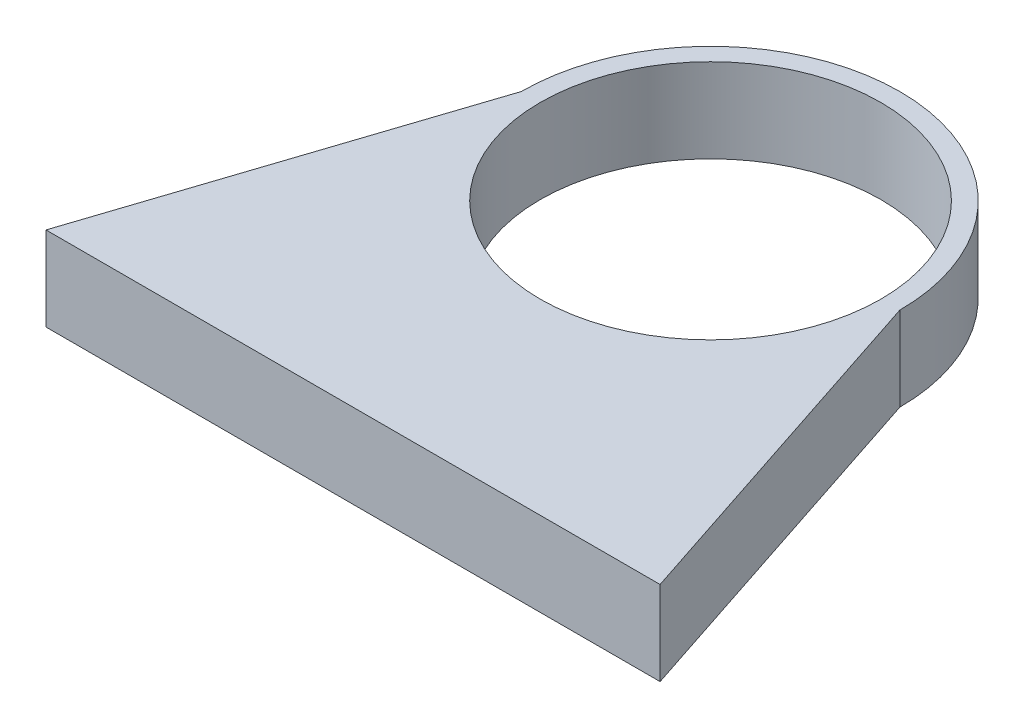
ISO-10303-21;
HEADER;
FILE_DESCRIPTION(('STEP AP214'),'2;1');
FILE_NAME('part.step','',(''),(''),'','','');
FILE_SCHEMA(('AUTOMOTIVE_DESIGN { 1 0 10303 214 1 1 1 1 }'));
ENDSEC;
DATA;
#1=APPLICATION_CONTEXT('core data for automotive mechanical design processes');
#2=APPLICATION_PROTOCOL_DEFINITION('international standard','automotive_design',2000,#1);
#3=PRODUCT_CONTEXT('',#1,'mechanical');
#4=PRODUCT('Part','Part','',(#3));
#5=PRODUCT_RELATED_PRODUCT_CATEGORY('part','',(#4));
#6=PRODUCT_DEFINITION_FORMATION('','',#4);
#7=PRODUCT_DEFINITION_CONTEXT('part definition',#1,'design');
#8=PRODUCT_DEFINITION('design','',#6,#7);
#9=PRODUCT_DEFINITION_SHAPE('','',#8);
#10=(LENGTH_UNIT() NAMED_UNIT(*) SI_UNIT(.MILLI.,.METRE.));
#11=(NAMED_UNIT(*) PLANE_ANGLE_UNIT() SI_UNIT($,.RADIAN.));
#12=(NAMED_UNIT(*) SI_UNIT($,.STERADIAN.) SOLID_ANGLE_UNIT());
#13=UNCERTAINTY_MEASURE_WITH_UNIT(LENGTH_MEASURE(1.E-05),#10,'distance_accuracy_value','');
#14=(GEOMETRIC_REPRESENTATION_CONTEXT(3) GLOBAL_UNCERTAINTY_ASSIGNED_CONTEXT((#13)) GLOBAL_UNIT_ASSIGNED_CONTEXT((#10,
#11,#12)) REPRESENTATION_CONTEXT('',''));
#15=CARTESIAN_POINT('',(0.,0.,0.));
#16=DIRECTION('',(0.,0.,1.));
#17=DIRECTION('',(1.,0.,0.));
#18=AXIS2_PLACEMENT_3D('',#15,#16,#17);
#19=CARTESIAN_POINT('',(0.,10.,0.));
#20=DIRECTION('',(0.,1.,0.));
#21=DIRECTION('',(0.,0.,1.));
#22=AXIS2_PLACEMENT_3D('',#19,#20,#21);
#23=PLANE('',#22);
#24=DIRECTION('',(0.312873574933825,0.,0.949794781049111));
#25=VECTOR('',#24,1.);
#26=CARTESIAN_POINT('',(22.5,10.,0.));
#27=LINE('',#26,#25);
#28=CARTESIAN_POINT('',(22.5,10.,0.));
#29=VERTEX_POINT('',#28);
#30=CARTESIAN_POINT('',(36.5,10.,42.5));
#31=VERTEX_POINT('',#30);
#32=EDGE_CURVE('E109',#29,#31,#27,.T.);
#33=ORIENTED_EDGE('',*,*,#32,.F.);
#34=CARTESIAN_POINT('',(0.,10.,0.));
#35=DIRECTION('',(0.,1.,0.));
#36=DIRECTION('',(0.,0.,1.));
#37=AXIS2_PLACEMENT_3D('',#34,#35,#36);
#38=CIRCLE('',#37,22.5);
#39=CARTESIAN_POINT('',(-22.5,10.,0.));
#40=VERTEX_POINT('',#39);
#41=EDGE_CURVE('E112',#29,#40,#38,.T.);
#42=ORIENTED_EDGE('',*,*,#41,.T.);
#43=DIRECTION('',(0.312873574933824,0.,-0.949794781049111));
#44=VECTOR('',#43,1.);
#45=CARTESIAN_POINT('',(-36.5,10.,42.5));
#46=LINE('',#45,#44);
#47=CARTESIAN_POINT('',(-36.5,10.,42.5));
#48=VERTEX_POINT('',#47);
#49=EDGE_CURVE('E102',#48,#40,#46,.T.);
#50=ORIENTED_EDGE('',*,*,#49,.F.);
#51=DIRECTION('',(1.,0.,0.));
#52=VECTOR('',#51,1.);
#53=CARTESIAN_POINT('',(-36.5,10.,42.5));
#54=LINE('',#53,#52);
#55=EDGE_CURVE('E97',#48,#31,#54,.T.);
#56=ORIENTED_EDGE('',*,*,#55,.T.);
#57=EDGE_LOOP('',(#33,#42,#50,#56));
#58=FACE_BOUND('',#57,.T.);
#59=CARTESIAN_POINT('',(0.,10.,0.));
#60=DIRECTION('',(0.,1.,0.));
#61=DIRECTION('',(0.,0.,1.));
#62=AXIS2_PLACEMENT_3D('',#59,#60,#61);
#63=CIRCLE('',#62,20.25);
#64=CARTESIAN_POINT('',(0.,10.,20.25));
#65=VERTEX_POINT('',#64);
#66=EDGE_CURVE('E121',#65,#65,#63,.T.);
#67=ORIENTED_EDGE('',*,*,#66,.F.);
#68=EDGE_LOOP('',(#67));
#69=FACE_BOUND('',#68,.T.);
#70=ADVANCED_FACE('F52',(#58,#69),#23,.T.);
#71=CARTESIAN_POINT('',(0.,0.,0.));
#72=DIRECTION('',(0.,1.,0.));
#73=DIRECTION('',(0.,0.,1.));
#74=AXIS2_PLACEMENT_3D('',#71,#72,#73);
#75=PLANE('',#74);
#76=DIRECTION('',(0.312873574933825,0.,0.949794781049111));
#77=VECTOR('',#76,1.);
#78=CARTESIAN_POINT('',(22.5,0.,0.));
#79=LINE('',#78,#77);
#80=CARTESIAN_POINT('',(22.5,0.,0.));
#81=VERTEX_POINT('',#80);
#82=CARTESIAN_POINT('',(36.5,0.,42.5));
#83=VERTEX_POINT('',#82);
#84=EDGE_CURVE('E117',#81,#83,#79,.T.);
#85=ORIENTED_EDGE('',*,*,#84,.T.);
#86=DIRECTION('',(1.,0.,0.));
#87=VECTOR('',#86,1.);
#88=CARTESIAN_POINT('',(-36.5,0.,42.5));
#89=LINE('',#88,#87);
#90=CARTESIAN_POINT('',(-36.5,0.,42.5));
#91=VERTEX_POINT('',#90);
#92=EDGE_CURVE('E120',#91,#83,#89,.T.);
#93=ORIENTED_EDGE('',*,*,#92,.F.);
#94=DIRECTION('',(0.312873574933824,0.,-0.949794781049111));
#95=VECTOR('',#94,1.);
#96=CARTESIAN_POINT('',(-36.5,0.,42.5));
#97=LINE('',#96,#95);
#98=CARTESIAN_POINT('',(-22.5,0.,0.));
#99=VERTEX_POINT('',#98);
#100=EDGE_CURVE('E104',#91,#99,#97,.T.);
#101=ORIENTED_EDGE('',*,*,#100,.T.);
#102=CARTESIAN_POINT('',(0.,0.,0.));
#103=DIRECTION('',(0.,1.,0.));
#104=DIRECTION('',(0.,0.,1.));
#105=AXIS2_PLACEMENT_3D('',#102,#103,#104);
#106=CIRCLE('',#105,22.5);
#107=EDGE_CURVE('E124',#81,#99,#106,.T.);
#108=ORIENTED_EDGE('',*,*,#107,.F.);
#109=EDGE_LOOP('',(#85,#93,#101,#108));
#110=FACE_BOUND('',#109,.T.);
#111=CARTESIAN_POINT('',(0.,0.,0.));
#112=DIRECTION('',(0.,1.,0.));
#113=DIRECTION('',(0.,0.,1.));
#114=AXIS2_PLACEMENT_3D('',#111,#112,#113);
#115=CIRCLE('',#114,20.25);
#116=CARTESIAN_POINT('',(0.,0.,20.25));
#117=VERTEX_POINT('',#116);
#118=EDGE_CURVE('E127',#117,#117,#115,.T.);
#119=ORIENTED_EDGE('',*,*,#118,.T.);
#120=EDGE_LOOP('',(#119));
#121=FACE_BOUND('',#120,.T.);
#122=ADVANCED_FACE('F136',(#110,#121),#75,.F.);
#123=CARTESIAN_POINT('',(22.5,10.,0.));
#124=DIRECTION('',(0.949794781049111,0.,-0.312873574933825));
#125=DIRECTION('',(-0.312873574933825,0.,-0.949794781049111));
#126=AXIS2_PLACEMENT_3D('',#123,#124,#125);
#127=PLANE('',#126);
#128=ORIENTED_EDGE('',*,*,#84,.F.);
#129=DIRECTION('',(0.,-1.,0.));
#130=VECTOR('',#129,1.);
#131=CARTESIAN_POINT('',(22.5,10.,0.));
#132=LINE('',#131,#130);
#133=EDGE_CURVE('E12',#29,#81,#132,.T.);
#134=ORIENTED_EDGE('',*,*,#133,.F.);
#135=ORIENTED_EDGE('',*,*,#32,.T.);
#136=DIRECTION('',(0.,-1.,0.));
#137=VECTOR('',#136,1.);
#138=CARTESIAN_POINT('',(36.5,10.,42.5));
#139=LINE('',#138,#137);
#140=EDGE_CURVE('E56',#31,#83,#139,.T.);
#141=ORIENTED_EDGE('',*,*,#140,.T.);
#142=EDGE_LOOP('',(#128,#134,#135,#141));
#143=FACE_BOUND('',#142,.T.);
#144=ADVANCED_FACE('F54',(#143),#127,.T.);
#145=CARTESIAN_POINT('',(0.,10.,0.));
#146=DIRECTION('',(0.,-1.,0.));
#147=DIRECTION('',(0.,0.,-1.));
#148=AXIS2_PLACEMENT_3D('',#145,#146,#147);
#149=CYLINDRICAL_SURFACE('',#148,22.5);
#150=ORIENTED_EDGE('',*,*,#107,.T.);
#151=DIRECTION('',(0.,-1.,0.));
#152=VECTOR('',#151,1.);
#153=CARTESIAN_POINT('',(-22.5,10.,0.));
#154=LINE('',#153,#152);
#155=EDGE_CURVE('E62',#40,#99,#154,.T.);
#156=ORIENTED_EDGE('',*,*,#155,.F.);
#157=ORIENTED_EDGE('',*,*,#41,.F.);
#158=ORIENTED_EDGE('',*,*,#133,.T.);
#159=EDGE_LOOP('',(#150,#156,#157,#158));
#160=FACE_BOUND('',#159,.T.);
#161=ADVANCED_FACE('F145',(#160),#149,.T.);
#162=CARTESIAN_POINT('',(-36.5,10.,42.5));
#163=DIRECTION('',(-0.949794781049111,0.,-0.312873574933825));
#164=DIRECTION('',(-0.312873574933825,0.,0.949794781049111));
#165=AXIS2_PLACEMENT_3D('',#162,#163,#164);
#166=PLANE('',#165);
#167=ORIENTED_EDGE('',*,*,#100,.F.);
#168=DIRECTION('',(0.,-1.,0.));
#169=VECTOR('',#168,1.);
#170=CARTESIAN_POINT('',(-36.5,10.,42.5));
#171=LINE('',#170,#169);
#172=EDGE_CURVE('E100',#48,#91,#171,.T.);
#173=ORIENTED_EDGE('',*,*,#172,.F.);
#174=ORIENTED_EDGE('',*,*,#49,.T.);
#175=ORIENTED_EDGE('',*,*,#155,.T.);
#176=EDGE_LOOP('',(#167,#173,#174,#175));
#177=FACE_BOUND('',#176,.T.);
#178=ADVANCED_FACE('F101',(#177),#166,.T.);
#179=CARTESIAN_POINT('',(-36.5,10.,42.5));
#180=DIRECTION('',(0.,0.,-1.));
#181=DIRECTION('',(-1.,0.,0.));
#182=AXIS2_PLACEMENT_3D('',#179,#180,#181);
#183=PLANE('',#182);
#184=ORIENTED_EDGE('',*,*,#92,.T.);
#185=ORIENTED_EDGE('',*,*,#140,.F.);
#186=ORIENTED_EDGE('',*,*,#55,.F.);
#187=ORIENTED_EDGE('',*,*,#172,.T.);
#188=EDGE_LOOP('',(#184,#185,#186,#187));
#189=FACE_BOUND('',#188,.T.);
#190=ADVANCED_FACE('F108',(#189),#183,.F.);
#191=CARTESIAN_POINT('',(0.,10.,0.));
#192=DIRECTION('',(0.,-1.,0.));
#193=DIRECTION('',(0.,0.,-1.));
#194=AXIS2_PLACEMENT_3D('',#191,#192,#193);
#195=CYLINDRICAL_SURFACE('',#194,20.25);
#196=ORIENTED_EDGE('',*,*,#66,.T.);
#197=EDGE_LOOP('',(#196));
#198=FACE_BOUND('',#197,.T.);
#199=ORIENTED_EDGE('',*,*,#118,.F.);
#200=EDGE_LOOP('',(#199));
#201=FACE_BOUND('',#200,.T.);
#202=ADVANCED_FACE('F133',(#198,#201),#195,.F.);
#203=CLOSED_SHELL('',(#70,#122,#144,#161,#178,#190,#202));
#204=MANIFOLD_SOLID_BREP('B2',#203);
#205=ADVANCED_BREP_SHAPE_REPRESENTATION('',(#18,#204),#14);
#206=SHAPE_DEFINITION_REPRESENTATION(#9,#205);
ENDSEC;
END-ISO-10303-21;
